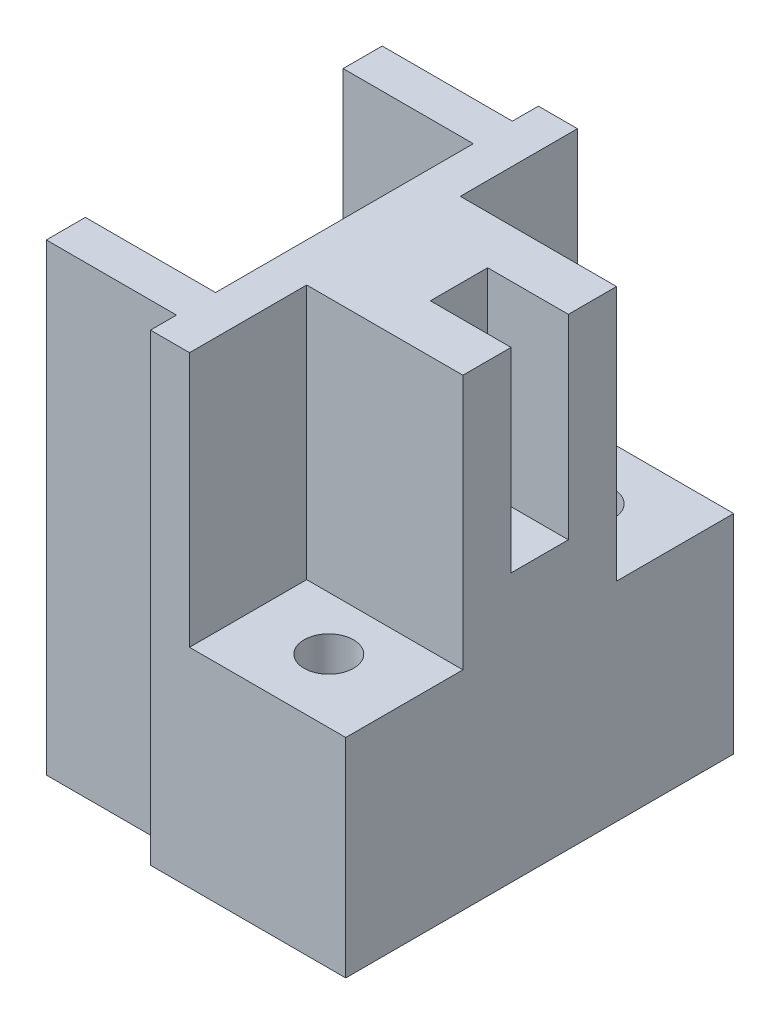
ISO-10303-21;
HEADER;
FILE_DESCRIPTION(('STEP AP214'),'2;1');
FILE_NAME('part.step','',(''),(''),'','','');
FILE_SCHEMA(('AUTOMOTIVE_DESIGN { 1 0 10303 214 1 1 1 1 }'));
ENDSEC;
DATA;
#1=APPLICATION_CONTEXT('core data for automotive mechanical design processes');
#2=APPLICATION_PROTOCOL_DEFINITION('international standard','automotive_design',2000,#1);
#3=PRODUCT_CONTEXT('',#1,'mechanical');
#4=PRODUCT('Part','Part','',(#3));
#5=PRODUCT_RELATED_PRODUCT_CATEGORY('part','',(#4));
#6=PRODUCT_DEFINITION_FORMATION('','',#4);
#7=PRODUCT_DEFINITION_CONTEXT('part definition',#1,'design');
#8=PRODUCT_DEFINITION('design','',#6,#7);
#9=PRODUCT_DEFINITION_SHAPE('','',#8);
#10=(LENGTH_UNIT() NAMED_UNIT(*) SI_UNIT(.MILLI.,.METRE.));
#11=(NAMED_UNIT(*) PLANE_ANGLE_UNIT() SI_UNIT($,.RADIAN.));
#12=(NAMED_UNIT(*) SI_UNIT($,.STERADIAN.) SOLID_ANGLE_UNIT());
#13=UNCERTAINTY_MEASURE_WITH_UNIT(LENGTH_MEASURE(1.E-05),#10,'distance_accuracy_value','');
#14=(GEOMETRIC_REPRESENTATION_CONTEXT(3) GLOBAL_UNCERTAINTY_ASSIGNED_CONTEXT((#13)) GLOBAL_UNIT_ASSIGNED_CONTEXT((#10,
#11,#12)) REPRESENTATION_CONTEXT('',''));
#15=CARTESIAN_POINT('',(0.,0.,0.));
#16=DIRECTION('',(0.,0.,1.));
#17=DIRECTION('',(1.,0.,0.));
#18=AXIS2_PLACEMENT_3D('',#15,#16,#17);
#19=CARTESIAN_POINT('',(32.3777015304282,45.212,-5.59150710167351));
#20=DIRECTION('',(0.,-1.,0.));
#21=DIRECTION('',(0.,0.,-1.));
#22=AXIS2_PLACEMENT_3D('',#19,#20,#21);
#23=CYLINDRICAL_SURFACE('',#22,2.413);
#24=CARTESIAN_POINT('',(32.3777015304282,0.,-5.59150710167351));
#25=DIRECTION('',(0.,1.,0.));
#26=DIRECTION('',(0.,0.,1.));
#27=AXIS2_PLACEMENT_3D('',#24,#25,#26);
#28=CIRCLE('',#27,2.413);
#29=CARTESIAN_POINT('',(32.3777015304282,0.,-8.0045071016735));
#30=VERTEX_POINT('',#29);
#31=EDGE_CURVE('E286',#30,#30,#28,.T.);
#32=CARTESIAN_POINT('',(32.3777015304282,20.32,-5.59150710167351));
#33=DIRECTION('',(0.,1.,0.));
#34=DIRECTION('',(0.,0.,1.));
#35=AXIS2_PLACEMENT_3D('',#32,#33,#34);
#36=CIRCLE('',#35,2.413);
#37=CARTESIAN_POINT('',(32.3777015304282,20.32,-8.0045071016735));
#38=VERTEX_POINT('',#37);
#39=EDGE_CURVE('E219',#38,#38,#36,.F.);
#40=CARTESIAN_POINT('',(32.3777015304282,0.,-8.0045071016735));
#41=CARTESIAN_POINT('',(32.3777015304282,0.211666666666661,-8.0045071016735));
#42=CARTESIAN_POINT('',(32.3777015304282,0.423333333333329,-8.0045071016735));
#43=CARTESIAN_POINT('',(32.3777015304282,0.846666666666662,-8.0045071016735));
#44=CARTESIAN_POINT('',(32.3777015304282,1.05833333333333,-8.0045071016735));
#45=CARTESIAN_POINT('',(32.3777015304282,1.48166666666666,-8.0045071016735));
#46=CARTESIAN_POINT('',(32.3777015304282,1.69333333333333,-8.0045071016735));
#47=CARTESIAN_POINT('',(32.3777015304282,2.11666666666666,-8.0045071016735));
#48=CARTESIAN_POINT('',(32.3777015304282,2.32833333333333,-8.0045071016735));
#49=CARTESIAN_POINT('',(32.3777015304282,2.75166666666666,-8.0045071016735));
#50=CARTESIAN_POINT('',(32.3777015304282,2.96333333333333,-8.0045071016735));
#51=CARTESIAN_POINT('',(32.3777015304282,3.38666666666666,-8.0045071016735));
#52=CARTESIAN_POINT('',(32.3777015304282,3.59833333333333,-8.0045071016735));
#53=CARTESIAN_POINT('',(32.3777015304282,4.02166666666666,-8.0045071016735));
#54=CARTESIAN_POINT('',(32.3777015304282,4.23333333333333,-8.0045071016735));
#55=CARTESIAN_POINT('',(32.3777015304282,4.65666666666666,-8.0045071016735));
#56=CARTESIAN_POINT('',(32.3777015304282,4.86833333333333,-8.0045071016735));
#57=CARTESIAN_POINT('',(32.3777015304282,5.29166666666666,-8.0045071016735));
#58=CARTESIAN_POINT('',(32.3777015304282,5.50333333333333,-8.0045071016735));
#59=CARTESIAN_POINT('',(32.3777015304282,5.92666666666666,-8.0045071016735));
#60=CARTESIAN_POINT('',(32.3777015304282,6.13833333333333,-8.0045071016735));
#61=CARTESIAN_POINT('',(32.3777015304282,6.56166666666666,-8.0045071016735));
#62=CARTESIAN_POINT('',(32.3777015304282,6.77333333333333,-8.0045071016735));
#63=CARTESIAN_POINT('',(32.3777015304282,7.19666666666666,-8.0045071016735));
#64=CARTESIAN_POINT('',(32.3777015304282,7.40833333333333,-8.0045071016735));
#65=CARTESIAN_POINT('',(32.3777015304282,7.83166666666666,-8.0045071016735));
#66=CARTESIAN_POINT('',(32.3777015304282,8.04333333333333,-8.0045071016735));
#67=CARTESIAN_POINT('',(32.3777015304282,8.46666666666667,-8.0045071016735));
#68=CARTESIAN_POINT('',(32.3777015304282,8.67833333333333,-8.0045071016735));
#69=CARTESIAN_POINT('',(32.3777015304282,9.10166666666667,-8.0045071016735));
#70=CARTESIAN_POINT('',(32.3777015304282,9.31333333333333,-8.0045071016735));
#71=CARTESIAN_POINT('',(32.3777015304282,9.73666666666666,-8.0045071016735));
#72=CARTESIAN_POINT('',(32.3777015304282,9.94833333333333,-8.0045071016735));
#73=CARTESIAN_POINT('',(32.3777015304282,10.3716666666667,-8.0045071016735));
#74=CARTESIAN_POINT('',(32.3777015304282,10.5833333333333,-8.0045071016735));
#75=CARTESIAN_POINT('',(32.3777015304282,11.0066666666667,-8.0045071016735));
#76=CARTESIAN_POINT('',(32.3777015304282,11.2183333333333,-8.0045071016735));
#77=CARTESIAN_POINT('',(32.3777015304282,11.6416666666667,-8.0045071016735));
#78=CARTESIAN_POINT('',(32.3777015304282,11.8533333333333,-8.0045071016735));
#79=CARTESIAN_POINT('',(32.3777015304282,12.2766666666667,-8.0045071016735));
#80=CARTESIAN_POINT('',(32.3777015304282,12.4883333333333,-8.0045071016735));
#81=CARTESIAN_POINT('',(32.3777015304282,12.9116666666667,-8.0045071016735));
#82=CARTESIAN_POINT('',(32.3777015304282,13.1233333333333,-8.0045071016735));
#83=CARTESIAN_POINT('',(32.3777015304282,13.5466666666667,-8.0045071016735));
#84=CARTESIAN_POINT('',(32.3777015304282,13.7583333333333,-8.0045071016735));
#85=CARTESIAN_POINT('',(32.3777015304282,14.1816666666667,-8.0045071016735));
#86=CARTESIAN_POINT('',(32.3777015304282,14.3933333333333,-8.0045071016735));
#87=CARTESIAN_POINT('',(32.3777015304282,14.8166666666667,-8.0045071016735));
#88=CARTESIAN_POINT('',(32.3777015304282,15.0283333333333,-8.0045071016735));
#89=CARTESIAN_POINT('',(32.3777015304282,15.4516666666667,-8.0045071016735));
#90=CARTESIAN_POINT('',(32.3777015304282,15.6633333333333,-8.0045071016735));
#91=CARTESIAN_POINT('',(32.3777015304282,16.0866666666667,-8.0045071016735));
#92=CARTESIAN_POINT('',(32.3777015304282,16.2983333333333,-8.0045071016735));
#93=CARTESIAN_POINT('',(32.3777015304282,16.7216666666667,-8.0045071016735));
#94=CARTESIAN_POINT('',(32.3777015304282,16.9333333333333,-8.0045071016735));
#95=CARTESIAN_POINT('',(32.3777015304282,17.3566666666667,-8.0045071016735));
#96=CARTESIAN_POINT('',(32.3777015304282,17.5683333333333,-8.0045071016735));
#97=CARTESIAN_POINT('',(32.3777015304282,17.9916666666667,-8.0045071016735));
#98=CARTESIAN_POINT('',(32.3777015304282,18.2033333333333,-8.0045071016735));
#99=CARTESIAN_POINT('',(32.3777015304282,18.6266666666667,-8.0045071016735));
#100=CARTESIAN_POINT('',(32.3777015304282,18.8383333333333,-8.0045071016735));
#101=CARTESIAN_POINT('',(32.3777015304282,19.2616666666667,-8.0045071016735));
#102=CARTESIAN_POINT('',(32.3777015304282,19.4733333333333,-8.0045071016735));
#103=CARTESIAN_POINT('',(32.3777015304282,19.8966666666667,-8.0045071016735));
#104=CARTESIAN_POINT('',(32.3777015304282,20.1083333333333,-8.0045071016735));
#105=CARTESIAN_POINT('',(32.3777015304282,20.32,-8.0045071016735));
#106=B_SPLINE_CURVE_WITH_KNOTS('',3,(#40,#41,#42,#43,#44,#45,#46,#47,#48,#49,#50,#51,#52,#53,
#54,#55,#56,#57,#58,#59,#60,#61,#62,#63,#64,#65,#66,#67,#68,#69,#70,#71,#72,#73,#74,#75,#76,#77,
#78,#79,#80,#81,#82,#83,#84,#85,#86,#87,#88,#89,#90,#91,#92,#93,#94,#95,#96,#97,#98,#99,#100,
#101,#102,#103,#104,#105),.UNSPECIFIED.,.F.,.F.,(4,2,2,2,2,2,2,2,2,2,2,2,2,2,2,2,2,2,2,2,2,2,2,
2,2,2,2,2,2,2,2,2,4),(0.,0.635000000000004,1.27,1.905,2.54,3.175,3.81,4.445,5.08,
5.71500000000001,6.35,6.985,7.62,8.25500000000001,8.89000000000001,9.52500000000001,10.16,
10.795,11.43,12.065,12.7,13.335,13.97,14.605,15.24,15.875,16.51,17.145,17.78,18.415,19.05,
19.685,20.32),.UNSPECIFIED.);
#107=EDGE_CURVE('BSEAM48',#30,#38,#106,.T.);
#108=ORIENTED_EDGE('',*,*,#31,.F.);
#109=ORIENTED_EDGE('',*,*,#39,.F.);
#110=ORIENTED_EDGE('',*,*,#107,.T.);
#111=ORIENTED_EDGE('',*,*,#107,.F.);
#112=EDGE_LOOP('',(#108,#110,#109,#111));
#113=FACE_BOUND('',#112,.T.);
#114=ADVANCED_FACE('F48',(#113),#23,.F.);
#115=CARTESIAN_POINT('',(32.3777015304282,45.212,-30.9915071016735));
#116=DIRECTION('',(0.,-1.,0.));
#117=DIRECTION('',(0.,0.,-1.));
#118=AXIS2_PLACEMENT_3D('',#115,#116,#117);
#119=CYLINDRICAL_SURFACE('',#118,2.413);
#120=CARTESIAN_POINT('',(32.3777015304282,0.,-30.9915071016735));
#121=DIRECTION('',(0.,1.,0.));
#122=DIRECTION('',(0.,0.,1.));
#123=AXIS2_PLACEMENT_3D('',#120,#121,#122);
#124=CIRCLE('',#123,2.413);
#125=CARTESIAN_POINT('',(32.3777015304282,0.,-33.4045071016735));
#126=VERTEX_POINT('',#125);
#127=EDGE_CURVE('E292',#126,#126,#124,.T.);
#128=CARTESIAN_POINT('',(32.3777015304282,20.32,-30.9915071016735));
#129=DIRECTION('',(0.,1.,0.));
#130=DIRECTION('',(0.,0.,1.));
#131=AXIS2_PLACEMENT_3D('',#128,#129,#130);
#132=CIRCLE('',#131,2.413);
#133=CARTESIAN_POINT('',(32.3777015304282,20.32,-33.4045071016735));
#134=VERTEX_POINT('',#133);
#135=EDGE_CURVE('E241',#134,#134,#132,.F.);
#136=CARTESIAN_POINT('',(32.3777015304282,0.,-33.4045071016735));
#137=CARTESIAN_POINT('',(32.3777015304282,0.211666666666661,-33.4045071016735));
#138=CARTESIAN_POINT('',(32.3777015304282,0.423333333333329,-33.4045071016735));
#139=CARTESIAN_POINT('',(32.3777015304282,0.846666666666662,-33.4045071016735));
#140=CARTESIAN_POINT('',(32.3777015304282,1.05833333333333,-33.4045071016735));
#141=CARTESIAN_POINT('',(32.3777015304282,1.48166666666666,-33.4045071016735));
#142=CARTESIAN_POINT('',(32.3777015304282,1.69333333333333,-33.4045071016735));
#143=CARTESIAN_POINT('',(32.3777015304282,2.11666666666666,-33.4045071016735));
#144=CARTESIAN_POINT('',(32.3777015304282,2.32833333333333,-33.4045071016735));
#145=CARTESIAN_POINT('',(32.3777015304282,2.75166666666666,-33.4045071016735));
#146=CARTESIAN_POINT('',(32.3777015304282,2.96333333333333,-33.4045071016735));
#147=CARTESIAN_POINT('',(32.3777015304282,3.38666666666666,-33.4045071016735));
#148=CARTESIAN_POINT('',(32.3777015304282,3.59833333333333,-33.4045071016735));
#149=CARTESIAN_POINT('',(32.3777015304282,4.02166666666666,-33.4045071016735));
#150=CARTESIAN_POINT('',(32.3777015304282,4.23333333333333,-33.4045071016735));
#151=CARTESIAN_POINT('',(32.3777015304282,4.65666666666666,-33.4045071016735));
#152=CARTESIAN_POINT('',(32.3777015304282,4.86833333333333,-33.4045071016735));
#153=CARTESIAN_POINT('',(32.3777015304282,5.29166666666666,-33.4045071016735));
#154=CARTESIAN_POINT('',(32.3777015304282,5.50333333333333,-33.4045071016735));
#155=CARTESIAN_POINT('',(32.3777015304282,5.92666666666666,-33.4045071016735));
#156=CARTESIAN_POINT('',(32.3777015304282,6.13833333333333,-33.4045071016735));
#157=CARTESIAN_POINT('',(32.3777015304282,6.56166666666666,-33.4045071016735));
#158=CARTESIAN_POINT('',(32.3777015304282,6.77333333333333,-33.4045071016735));
#159=CARTESIAN_POINT('',(32.3777015304282,7.19666666666666,-33.4045071016735));
#160=CARTESIAN_POINT('',(32.3777015304282,7.40833333333333,-33.4045071016735));
#161=CARTESIAN_POINT('',(32.3777015304282,7.83166666666666,-33.4045071016735));
#162=CARTESIAN_POINT('',(32.3777015304282,8.04333333333333,-33.4045071016735));
#163=CARTESIAN_POINT('',(32.3777015304282,8.46666666666667,-33.4045071016735));
#164=CARTESIAN_POINT('',(32.3777015304282,8.67833333333333,-33.4045071016735));
#165=CARTESIAN_POINT('',(32.3777015304282,9.10166666666667,-33.4045071016735));
#166=CARTESIAN_POINT('',(32.3777015304282,9.31333333333333,-33.4045071016735));
#167=CARTESIAN_POINT('',(32.3777015304282,9.73666666666666,-33.4045071016735));
#168=CARTESIAN_POINT('',(32.3777015304282,9.94833333333333,-33.4045071016735));
#169=CARTESIAN_POINT('',(32.3777015304282,10.3716666666667,-33.4045071016735));
#170=CARTESIAN_POINT('',(32.3777015304282,10.5833333333333,-33.4045071016735));
#171=CARTESIAN_POINT('',(32.3777015304282,11.0066666666667,-33.4045071016735));
#172=CARTESIAN_POINT('',(32.3777015304282,11.2183333333333,-33.4045071016735));
#173=CARTESIAN_POINT('',(32.3777015304282,11.6416666666667,-33.4045071016735));
#174=CARTESIAN_POINT('',(32.3777015304282,11.8533333333333,-33.4045071016735));
#175=CARTESIAN_POINT('',(32.3777015304282,12.2766666666667,-33.4045071016735));
#176=CARTESIAN_POINT('',(32.3777015304282,12.4883333333333,-33.4045071016735));
#177=CARTESIAN_POINT('',(32.3777015304282,12.9116666666667,-33.4045071016735));
#178=CARTESIAN_POINT('',(32.3777015304282,13.1233333333333,-33.4045071016735));
#179=CARTESIAN_POINT('',(32.3777015304282,13.5466666666667,-33.4045071016735));
#180=CARTESIAN_POINT('',(32.3777015304282,13.7583333333333,-33.4045071016735));
#181=CARTESIAN_POINT('',(32.3777015304282,14.1816666666667,-33.4045071016735));
#182=CARTESIAN_POINT('',(32.3777015304282,14.3933333333333,-33.4045071016735));
#183=CARTESIAN_POINT('',(32.3777015304282,14.8166666666667,-33.4045071016735));
#184=CARTESIAN_POINT('',(32.3777015304282,15.0283333333333,-33.4045071016735));
#185=CARTESIAN_POINT('',(32.3777015304282,15.4516666666667,-33.4045071016735));
#186=CARTESIAN_POINT('',(32.3777015304282,15.6633333333333,-33.4045071016735));
#187=CARTESIAN_POINT('',(32.3777015304282,16.0866666666667,-33.4045071016735));
#188=CARTESIAN_POINT('',(32.3777015304282,16.2983333333333,-33.4045071016735));
#189=CARTESIAN_POINT('',(32.3777015304282,16.7216666666667,-33.4045071016735));
#190=CARTESIAN_POINT('',(32.3777015304282,16.9333333333333,-33.4045071016735));
#191=CARTESIAN_POINT('',(32.3777015304282,17.3566666666667,-33.4045071016735));
#192=CARTESIAN_POINT('',(32.3777015304282,17.5683333333333,-33.4045071016735));
#193=CARTESIAN_POINT('',(32.3777015304282,17.9916666666667,-33.4045071016735));
#194=CARTESIAN_POINT('',(32.3777015304282,18.2033333333333,-33.4045071016735));
#195=CARTESIAN_POINT('',(32.3777015304282,18.6266666666667,-33.4045071016735));
#196=CARTESIAN_POINT('',(32.3777015304282,18.8383333333333,-33.4045071016735));
#197=CARTESIAN_POINT('',(32.3777015304282,19.2616666666667,-33.4045071016735));
#198=CARTESIAN_POINT('',(32.3777015304282,19.4733333333333,-33.4045071016735));
#199=CARTESIAN_POINT('',(32.3777015304282,19.8966666666667,-33.4045071016735));
#200=CARTESIAN_POINT('',(32.3777015304282,20.1083333333333,-33.4045071016735));
#201=CARTESIAN_POINT('',(32.3777015304282,20.32,-33.4045071016735));
#202=B_SPLINE_CURVE_WITH_KNOTS('',3,(#136,#137,#138,#139,#140,#141,#142,#143,#144,#145,#146,
#147,#148,#149,#150,#151,#152,#153,#154,#155,#156,#157,#158,#159,#160,#161,#162,#163,#164,#165,
#166,#167,#168,#169,#170,#171,#172,#173,#174,#175,#176,#177,#178,#179,#180,#181,#182,#183,#184,
#185,#186,#187,#188,#189,#190,#191,#192,#193,#194,#195,#196,#197,#198,#199,#200,#201),
.UNSPECIFIED.,.F.,.F.,(4,2,2,2,2,2,2,2,2,2,2,2,2,2,2,2,2,2,2,2,2,2,2,2,2,2,2,2,2,2,2,2,4),(0.,
0.635000000000004,1.27,1.905,2.54,3.175,3.81,4.445,5.08,5.71500000000001,6.35,6.985,7.62,
8.25500000000001,8.89000000000001,9.52500000000001,10.16,10.795,11.43,12.065,12.7,13.335,13.97,
14.605,15.24,15.875,16.51,17.145,17.78,18.415,19.05,19.685,20.32),.UNSPECIFIED.);
#203=EDGE_CURVE('BSEAM538',#126,#134,#202,.T.);
#204=ORIENTED_EDGE('',*,*,#127,.F.);
#205=ORIENTED_EDGE('',*,*,#135,.F.);
#206=ORIENTED_EDGE('',*,*,#203,.T.);
#207=ORIENTED_EDGE('',*,*,#203,.F.);
#208=EDGE_LOOP('',(#204,#206,#205,#207));
#209=FACE_BOUND('',#208,.T.);
#210=ADVANCED_FACE('F538',(#209),#119,.F.);
#211=CARTESIAN_POINT('',(0.,45.212,-15.4975071016735));
#212=DIRECTION('',(0.,0.,-1.));
#213=DIRECTION('',(-1.,0.,0.));
#214=AXIS2_PLACEMENT_3D('',#211,#212,#213);
#215=PLANE('',#214);
#216=DIRECTION('',(1.,0.,0.));
#217=VECTOR('',#216,1.);
#218=CARTESIAN_POINT('',(0.,26.162,-15.4975071016735));
#219=LINE('',#218,#217);
#220=CARTESIAN_POINT('',(32.3777015304282,26.162,-15.4975071016735));
#221=VERTEX_POINT('',#220);
#222=CARTESIAN_POINT('',(40.2517015304282,26.162,-15.4975071016735));
#223=VERTEX_POINT('',#222);
#224=EDGE_CURVE('E279',#221,#223,#219,.T.);
#225=ORIENTED_EDGE('',*,*,#224,.F.);
#226=DIRECTION('',(0.,-1.,0.));
#227=VECTOR('',#226,1.);
#228=CARTESIAN_POINT('',(32.3777015304282,45.212,-15.4975071016735));
#229=LINE('',#228,#227);
#230=CARTESIAN_POINT('',(32.3777015304282,45.212,-15.4975071016735));
#231=VERTEX_POINT('',#230);
#232=EDGE_CURVE('E12',#231,#221,#229,.T.);
#233=ORIENTED_EDGE('',*,*,#232,.F.);
#234=DIRECTION('',(1.,0.,0.));
#235=VECTOR('',#234,1.);
#236=CARTESIAN_POINT('',(0.,45.212,-15.4975071016735));
#237=LINE('',#236,#235);
#238=CARTESIAN_POINT('',(40.2517015304282,45.212,-15.4975071016735));
#239=VERTEX_POINT('',#238);
#240=EDGE_CURVE('E287',#231,#239,#237,.T.);
#241=ORIENTED_EDGE('',*,*,#240,.T.);
#242=DIRECTION('',(0.,-1.,0.));
#243=VECTOR('',#242,1.);
#244=CARTESIAN_POINT('',(40.2517015304282,45.212,-15.4975071016735));
#245=LINE('',#244,#243);
#246=EDGE_CURVE('E346',#239,#223,#245,.T.);
#247=ORIENTED_EDGE('',*,*,#246,.T.);
#248=EDGE_LOOP('',(#225,#233,#241,#247));
#249=FACE_BOUND('',#248,.T.);
#250=ADVANCED_FACE('F464',(#249),#215,.T.);
#251=CARTESIAN_POINT('',(32.3777015304282,45.212,0.));
#252=DIRECTION('',(1.,0.,0.));
#253=DIRECTION('',(0.,0.,-1.));
#254=AXIS2_PLACEMENT_3D('',#251,#252,#253);
#255=PLANE('',#254);
#256=DIRECTION('',(0.,0.,1.));
#257=VECTOR('',#256,1.);
#258=CARTESIAN_POINT('',(32.3777015304282,26.162,0.));
#259=LINE('',#258,#257);
#260=CARTESIAN_POINT('',(32.3777015304282,26.162,-21.0855071016735));
#261=VERTEX_POINT('',#260);
#262=EDGE_CURVE('E276',#261,#221,#259,.T.);
#263=ORIENTED_EDGE('',*,*,#262,.F.);
#264=DIRECTION('',(0.,-1.,0.));
#265=VECTOR('',#264,1.);
#266=CARTESIAN_POINT('',(32.3777015304282,45.212,-21.0855071016735));
#267=LINE('',#266,#265);
#268=CARTESIAN_POINT('',(32.3777015304282,45.212,-21.0855071016735));
#269=VERTEX_POINT('',#268);
#270=EDGE_CURVE('E56',#269,#261,#267,.T.);
#271=ORIENTED_EDGE('',*,*,#270,.F.);
#272=DIRECTION('',(0.,0.,1.));
#273=VECTOR('',#272,1.);
#274=CARTESIAN_POINT('',(32.3777015304282,45.212,0.));
#275=LINE('',#274,#273);
#276=EDGE_CURVE('E291',#269,#231,#275,.T.);
#277=ORIENTED_EDGE('',*,*,#276,.T.);
#278=ORIENTED_EDGE('',*,*,#232,.T.);
#279=EDGE_LOOP('',(#263,#271,#277,#278));
#280=FACE_BOUND('',#279,.T.);
#281=ADVANCED_FACE('F456',(#280),#255,.T.);
#282=CARTESIAN_POINT('',(0.,45.212,-21.0855071016735));
#283=DIRECTION('',(0.,0.,1.));
#284=DIRECTION('',(1.,0.,0.));
#285=AXIS2_PLACEMENT_3D('',#282,#283,#284);
#286=PLANE('',#285);
#287=DIRECTION('',(-1.,0.,0.));
#288=VECTOR('',#287,1.);
#289=CARTESIAN_POINT('',(0.,26.162,-21.0855071016735));
#290=LINE('',#289,#288);
#291=CARTESIAN_POINT('',(40.2517015304281,26.162,-21.0855071016735));
#292=VERTEX_POINT('',#291);
#293=EDGE_CURVE('E238',#292,#261,#290,.T.);
#294=ORIENTED_EDGE('',*,*,#293,.F.);
#295=DIRECTION('',(0.,-1.,0.));
#296=VECTOR('',#295,1.);
#297=CARTESIAN_POINT('',(40.2517015304281,45.212,-21.0855071016735));
#298=LINE('',#297,#296);
#299=CARTESIAN_POINT('',(40.2517015304281,45.212,-21.0855071016735));
#300=VERTEX_POINT('',#299);
#301=EDGE_CURVE('E443',#300,#292,#298,.T.);
#302=ORIENTED_EDGE('',*,*,#301,.F.);
#303=DIRECTION('',(-1.,0.,0.));
#304=VECTOR('',#303,1.);
#305=CARTESIAN_POINT('',(0.,45.212,-21.0855071016735));
#306=LINE('',#305,#304);
#307=EDGE_CURVE('E296',#300,#269,#306,.T.);
#308=ORIENTED_EDGE('',*,*,#307,.T.);
#309=ORIENTED_EDGE('',*,*,#270,.T.);
#310=EDGE_LOOP('',(#294,#302,#308,#309));
#311=FACE_BOUND('',#310,.T.);
#312=ADVANCED_FACE('F450',(#311),#286,.T.);
#313=CARTESIAN_POINT('',(0.,45.212,-37.2145071016735));
#314=DIRECTION('',(0.,0.,1.));
#315=DIRECTION('',(1.,0.,0.));
#316=AXIS2_PLACEMENT_3D('',#313,#314,#315);
#317=PLANE('',#316);
#318=DIRECTION('',(-1.,0.,0.));
#319=VECTOR('',#318,1.);
#320=CARTESIAN_POINT('',(0.,45.212,-37.2145071016735));
#321=LINE('',#320,#319);
#322=CARTESIAN_POINT('',(25.0117015304281,45.212,-37.2145071016735));
#323=VERTEX_POINT('',#322);
#324=CARTESIAN_POINT('',(21.2017015304281,45.212,-37.2145071016735));
#325=VERTEX_POINT('',#324);
#326=EDGE_CURVE('E303',#323,#325,#321,.T.);
#327=ORIENTED_EDGE('',*,*,#326,.F.);
#328=DIRECTION('',(0.,1.,0.));
#329=VECTOR('',#328,1.);
#330=CARTESIAN_POINT('',(25.0117015304281,20.32,-37.2145071016735));
#331=LINE('',#330,#329);
#332=CARTESIAN_POINT('',(25.0117015304281,20.32,-37.2145071016735));
#333=VERTEX_POINT('',#332);
#334=EDGE_CURVE('E232',#333,#323,#331,.T.);
#335=ORIENTED_EDGE('',*,*,#334,.F.);
#336=DIRECTION('',(-1.,0.,0.));
#337=VECTOR('',#336,1.);
#338=CARTESIAN_POINT('',(0.,20.32,-37.2145071016735));
#339=LINE('',#338,#337);
#340=CARTESIAN_POINT('',(40.2517015304281,20.32,-37.2145071016735));
#341=VERTEX_POINT('',#340);
#342=EDGE_CURVE('E257',#341,#333,#339,.T.);
#343=ORIENTED_EDGE('',*,*,#342,.F.);
#344=DIRECTION('',(0.,-1.,0.));
#345=VECTOR('',#344,1.);
#346=CARTESIAN_POINT('',(40.2517015304281,45.212,-37.2145071016735));
#347=LINE('',#346,#345);
#348=CARTESIAN_POINT('',(40.2517015304281,0.,-37.2145071016735));
#349=VERTEX_POINT('',#348);
#350=EDGE_CURVE('E440',#341,#349,#347,.T.);
#351=ORIENTED_EDGE('',*,*,#350,.T.);
#352=DIRECTION('',(-1.,0.,0.));
#353=VECTOR('',#352,1.);
#354=CARTESIAN_POINT('',(0.,0.,-37.2145071016735));
#355=LINE('',#354,#353);
#356=CARTESIAN_POINT('',(21.2017015304281,0.,-37.2145071016735));
#357=VERTEX_POINT('',#356);
#358=EDGE_CURVE('E350',#349,#357,#355,.T.);
#359=ORIENTED_EDGE('',*,*,#358,.T.);
#360=DIRECTION('',(0.,-1.,0.));
#361=VECTOR('',#360,1.);
#362=CARTESIAN_POINT('',(21.2017015304281,45.212,-37.2145071016735));
#363=LINE('',#362,#361);
#364=EDGE_CURVE('E436',#325,#357,#363,.T.);
#365=ORIENTED_EDGE('',*,*,#364,.F.);
#366=EDGE_LOOP('',(#327,#335,#343,#351,#359,#365));
#367=FACE_BOUND('',#366,.T.);
#368=ADVANCED_FACE('F482',(#367),#317,.F.);
#369=CARTESIAN_POINT('',(21.2017015304281,45.212,0.));
#370=DIRECTION('',(1.,0.,0.));
#371=DIRECTION('',(0.,0.,-1.));
#372=AXIS2_PLACEMENT_3D('',#369,#370,#371);
#373=PLANE('',#372);
#374=DIRECTION('',(0.,0.,1.));
#375=VECTOR('',#374,1.);
#376=CARTESIAN_POINT('',(21.2017015304281,0.,0.));
#377=LINE('',#376,#375);
#378=CARTESIAN_POINT('',(21.2017015304281,0.,-34.6745071016735));
#379=VERTEX_POINT('',#378);
#380=EDGE_CURVE('E354',#357,#379,#377,.T.);
#381=ORIENTED_EDGE('',*,*,#380,.T.);
#382=DIRECTION('',(0.,-1.,0.));
#383=VECTOR('',#382,1.);
#384=CARTESIAN_POINT('',(21.2017015304281,45.212,-34.6745071016735));
#385=LINE('',#384,#383);
#386=CARTESIAN_POINT('',(21.2017015304281,45.212,-34.6745071016735));
#387=VERTEX_POINT('',#386);
#388=EDGE_CURVE('E432',#387,#379,#385,.T.);
#389=ORIENTED_EDGE('',*,*,#388,.F.);
#390=DIRECTION('',(0.,0.,1.));
#391=VECTOR('',#390,1.);
#392=CARTESIAN_POINT('',(21.2017015304281,45.212,0.));
#393=LINE('',#392,#391);
#394=EDGE_CURVE('E306',#325,#387,#393,.T.);
#395=ORIENTED_EDGE('',*,*,#394,.F.);
#396=ORIENTED_EDGE('',*,*,#364,.T.);
#397=EDGE_LOOP('',(#381,#389,#395,#396));
#398=FACE_BOUND('',#397,.T.);
#399=ADVANCED_FACE('F487',(#398),#373,.F.);
#400=CARTESIAN_POINT('',(0.,45.212,-34.6745071016735));
#401=DIRECTION('',(0.,0.,1.));
#402=DIRECTION('',(1.,0.,0.));
#403=AXIS2_PLACEMENT_3D('',#400,#401,#402);
#404=PLANE('',#403);
#405=DIRECTION('',(-1.,0.,0.));
#406=VECTOR('',#405,1.);
#407=CARTESIAN_POINT('',(0.,0.,-34.6745071016735));
#408=LINE('',#407,#406);
#409=CARTESIAN_POINT('',(8.50170153042815,0.,-34.6745071016735));
#410=VERTEX_POINT('',#409);
#411=EDGE_CURVE('E358',#379,#410,#408,.T.);
#412=ORIENTED_EDGE('',*,*,#411,.T.);
#413=DIRECTION('',(0.,-1.,0.));
#414=VECTOR('',#413,1.);
#415=CARTESIAN_POINT('',(8.50170153042815,45.212,-34.6745071016735));
#416=LINE('',#415,#414);
#417=CARTESIAN_POINT('',(8.50170153042815,45.212,-34.6745071016735));
#418=VERTEX_POINT('',#417);
#419=EDGE_CURVE('E428',#418,#410,#416,.T.);
#420=ORIENTED_EDGE('',*,*,#419,.F.);
#421=DIRECTION('',(-1.,0.,0.));
#422=VECTOR('',#421,1.);
#423=CARTESIAN_POINT('',(0.,45.212,-34.6745071016735));
#424=LINE('',#423,#422);
#425=EDGE_CURVE('E310',#387,#418,#424,.T.);
#426=ORIENTED_EDGE('',*,*,#425,.F.);
#427=ORIENTED_EDGE('',*,*,#388,.T.);
#428=EDGE_LOOP('',(#412,#420,#426,#427));
#429=FACE_BOUND('',#428,.T.);
#430=ADVANCED_FACE('F489',(#429),#404,.F.);
#431=CARTESIAN_POINT('',(8.50170153042816,45.212,0.));
#432=DIRECTION('',(1.,0.,0.));
#433=DIRECTION('',(0.,0.,-1.));
#434=AXIS2_PLACEMENT_3D('',#431,#432,#433);
#435=PLANE('',#434);
#436=DIRECTION('',(0.,0.,1.));
#437=VECTOR('',#436,1.);
#438=CARTESIAN_POINT('',(8.50170153042816,0.,0.));
#439=LINE('',#438,#437);
#440=CARTESIAN_POINT('',(8.50170153042815,0.,-30.8645071016735));
#441=VERTEX_POINT('',#440);
#442=EDGE_CURVE('E362',#410,#441,#439,.T.);
#443=ORIENTED_EDGE('',*,*,#442,.T.);
#444=DIRECTION('',(0.,-1.,0.));
#445=VECTOR('',#444,1.);
#446=CARTESIAN_POINT('',(8.50170153042815,45.212,-30.8645071016735));
#447=LINE('',#446,#445);
#448=CARTESIAN_POINT('',(8.50170153042815,45.212,-30.8645071016735));
#449=VERTEX_POINT('',#448);
#450=EDGE_CURVE('E424',#449,#441,#447,.T.);
#451=ORIENTED_EDGE('',*,*,#450,.F.);
#452=DIRECTION('',(0.,0.,1.));
#453=VECTOR('',#452,1.);
#454=CARTESIAN_POINT('',(8.50170153042816,45.212,0.));
#455=LINE('',#454,#453);
#456=EDGE_CURVE('E314',#418,#449,#455,.T.);
#457=ORIENTED_EDGE('',*,*,#456,.F.);
#458=ORIENTED_EDGE('',*,*,#419,.T.);
#459=EDGE_LOOP('',(#443,#451,#457,#458));
#460=FACE_BOUND('',#459,.T.);
#461=ADVANCED_FACE('F494',(#460),#435,.F.);
#462=CARTESIAN_POINT('',(0.,45.212,-30.8645071016735));
#463=DIRECTION('',(0.,0.,-1.));
#464=DIRECTION('',(-1.,0.,0.));
#465=AXIS2_PLACEMENT_3D('',#462,#463,#464);
#466=PLANE('',#465);
#467=DIRECTION('',(1.,0.,0.));
#468=VECTOR('',#467,1.);
#469=CARTESIAN_POINT('',(0.,0.,-30.8645071016735));
#470=LINE('',#469,#468);
#471=CARTESIAN_POINT('',(21.2017015304281,0.,-30.8645071016735));
#472=VERTEX_POINT('',#471);
#473=EDGE_CURVE('E366',#441,#472,#470,.T.);
#474=ORIENTED_EDGE('',*,*,#473,.T.);
#475=DIRECTION('',(0.,-1.,0.));
#476=VECTOR('',#475,1.);
#477=CARTESIAN_POINT('',(21.2017015304281,45.212,-30.8645071016735));
#478=LINE('',#477,#476);
#479=CARTESIAN_POINT('',(21.2017015304281,45.212,-30.8645071016735));
#480=VERTEX_POINT('',#479);
#481=EDGE_CURVE('E420',#480,#472,#478,.T.);
#482=ORIENTED_EDGE('',*,*,#481,.F.);
#483=DIRECTION('',(1.,0.,0.));
#484=VECTOR('',#483,1.);
#485=CARTESIAN_POINT('',(0.,45.212,-30.8645071016735));
#486=LINE('',#485,#484);
#487=EDGE_CURVE('E318',#449,#480,#486,.T.);
#488=ORIENTED_EDGE('',*,*,#487,.F.);
#489=ORIENTED_EDGE('',*,*,#450,.T.);
#490=EDGE_LOOP('',(#474,#482,#488,#489));
#491=FACE_BOUND('',#490,.T.);
#492=ADVANCED_FACE('F496',(#491),#466,.F.);
#493=CARTESIAN_POINT('',(21.2017015304281,45.212,0.));
#494=DIRECTION('',(1.,0.,0.));
#495=DIRECTION('',(0.,0.,-1.));
#496=AXIS2_PLACEMENT_3D('',#493,#494,#495);
#497=PLANE('',#496);
#498=DIRECTION('',(0.,0.,1.));
#499=VECTOR('',#498,1.);
#500=CARTESIAN_POINT('',(21.2017015304281,0.,0.));
#501=LINE('',#500,#499);
#502=CARTESIAN_POINT('',(21.2017015304281,0.,-5.71850710167351));
#503=VERTEX_POINT('',#502);
#504=EDGE_CURVE('E370',#472,#503,#501,.T.);
#505=ORIENTED_EDGE('',*,*,#504,.T.);
#506=DIRECTION('',(0.,-1.,0.));
#507=VECTOR('',#506,1.);
#508=CARTESIAN_POINT('',(21.2017015304281,45.212,-5.71850710167351));
#509=LINE('',#508,#507);
#510=CARTESIAN_POINT('',(21.2017015304281,45.212,-5.71850710167351));
#511=VERTEX_POINT('',#510);
#512=EDGE_CURVE('E417',#511,#503,#509,.T.);
#513=ORIENTED_EDGE('',*,*,#512,.F.);
#514=DIRECTION('',(0.,0.,1.));
#515=VECTOR('',#514,1.);
#516=CARTESIAN_POINT('',(21.2017015304281,45.212,0.));
#517=LINE('',#516,#515);
#518=EDGE_CURVE('E322',#480,#511,#517,.T.);
#519=ORIENTED_EDGE('',*,*,#518,.F.);
#520=ORIENTED_EDGE('',*,*,#481,.T.);
#521=EDGE_LOOP('',(#505,#513,#519,#520));
#522=FACE_BOUND('',#521,.T.);
#523=ADVANCED_FACE('F498',(#522),#497,.F.);
#524=CARTESIAN_POINT('',(0.,45.212,-5.71850710167351));
#525=DIRECTION('',(0.,0.,-1.));
#526=DIRECTION('',(-1.,0.,0.));
#527=AXIS2_PLACEMENT_3D('',#524,#525,#526);
#528=PLANE('',#527);
#529=DIRECTION('',(1.,0.,0.));
#530=VECTOR('',#529,1.);
#531=CARTESIAN_POINT('',(0.,0.,-5.71850710167351));
#532=LINE('',#531,#530);
#533=CARTESIAN_POINT('',(8.50170153042814,0.,-5.71850710167351));
#534=VERTEX_POINT('',#533);
#535=EDGE_CURVE('E374',#534,#503,#532,.T.);
#536=ORIENTED_EDGE('',*,*,#535,.F.);
#537=DIRECTION('',(0.,-1.,0.));
#538=VECTOR('',#537,1.);
#539=CARTESIAN_POINT('',(8.50170153042814,45.212,-5.71850710167351));
#540=LINE('',#539,#538);
#541=CARTESIAN_POINT('',(8.50170153042814,45.212,-5.71850710167351));
#542=VERTEX_POINT('',#541);
#543=EDGE_CURVE('E414',#542,#534,#540,.T.);
#544=ORIENTED_EDGE('',*,*,#543,.F.);
#545=DIRECTION('',(1.,0.,0.));
#546=VECTOR('',#545,1.);
#547=CARTESIAN_POINT('',(0.,45.212,-5.71850710167351));
#548=LINE('',#547,#546);
#549=EDGE_CURVE('E325',#542,#511,#548,.T.);
#550=ORIENTED_EDGE('',*,*,#549,.T.);
#551=ORIENTED_EDGE('',*,*,#512,.T.);
#552=EDGE_LOOP('',(#536,#544,#550,#551));
#553=FACE_BOUND('',#552,.T.);
#554=ADVANCED_FACE('F527',(#553),#528,.T.);
#555=CARTESIAN_POINT('',(8.50170153042814,45.212,0.));
#556=DIRECTION('',(-1.,0.,0.));
#557=DIRECTION('',(0.,0.,1.));
#558=AXIS2_PLACEMENT_3D('',#555,#556,#557);
#559=PLANE('',#558);
#560=DIRECTION('',(0.,0.,-1.));
#561=VECTOR('',#560,1.);
#562=CARTESIAN_POINT('',(8.50170153042814,0.,0.));
#563=LINE('',#562,#561);
#564=CARTESIAN_POINT('',(8.50170153042814,0.,-1.90850710167351));
#565=VERTEX_POINT('',#564);
#566=EDGE_CURVE('E379',#565,#534,#563,.T.);
#567=ORIENTED_EDGE('',*,*,#566,.F.);
#568=DIRECTION('',(0.,-1.,0.));
#569=VECTOR('',#568,1.);
#570=CARTESIAN_POINT('',(8.50170153042814,45.212,-1.90850710167351));
#571=LINE('',#570,#569);
#572=CARTESIAN_POINT('',(8.50170153042814,45.212,-1.90850710167351));
#573=VERTEX_POINT('',#572);
#574=EDGE_CURVE('E411',#573,#565,#571,.T.);
#575=ORIENTED_EDGE('',*,*,#574,.F.);
#576=DIRECTION('',(0.,0.,-1.));
#577=VECTOR('',#576,1.);
#578=CARTESIAN_POINT('',(8.50170153042814,45.212,0.));
#579=LINE('',#578,#577);
#580=EDGE_CURVE('E330',#573,#542,#579,.T.);
#581=ORIENTED_EDGE('',*,*,#580,.T.);
#582=ORIENTED_EDGE('',*,*,#543,.T.);
#583=EDGE_LOOP('',(#567,#575,#581,#582));
#584=FACE_BOUND('',#583,.T.);
#585=ADVANCED_FACE('F506',(#584),#559,.T.);
#586=CARTESIAN_POINT('',(0.,45.212,-1.90850710167351));
#587=DIRECTION('',(0.,0.,1.));
#588=DIRECTION('',(1.,0.,0.));
#589=AXIS2_PLACEMENT_3D('',#586,#587,#588);
#590=PLANE('',#589);
#591=DIRECTION('',(-1.,0.,0.));
#592=VECTOR('',#591,1.);
#593=CARTESIAN_POINT('',(0.,0.,-1.90850710167351));
#594=LINE('',#593,#592);
#595=CARTESIAN_POINT('',(21.2017015304281,0.,-1.90850710167351));
#596=VERTEX_POINT('',#595);
#597=EDGE_CURVE('E383',#596,#565,#594,.T.);
#598=ORIENTED_EDGE('',*,*,#597,.F.);
#599=DIRECTION('',(0.,-1.,0.));
#600=VECTOR('',#599,1.);
#601=CARTESIAN_POINT('',(21.2017015304281,45.212,-1.90850710167351));
#602=LINE('',#601,#600);
#603=CARTESIAN_POINT('',(21.2017015304281,45.212,-1.90850710167351));
#604=VERTEX_POINT('',#603);
#605=EDGE_CURVE('E408',#604,#596,#602,.T.);
#606=ORIENTED_EDGE('',*,*,#605,.F.);
#607=DIRECTION('',(-1.,0.,0.));
#608=VECTOR('',#607,1.);
#609=CARTESIAN_POINT('',(0.,45.212,-1.90850710167351));
#610=LINE('',#609,#608);
#611=EDGE_CURVE('E334',#604,#573,#610,.T.);
#612=ORIENTED_EDGE('',*,*,#611,.T.);
#613=ORIENTED_EDGE('',*,*,#574,.T.);
#614=EDGE_LOOP('',(#598,#606,#612,#613));
#615=FACE_BOUND('',#614,.T.);
#616=ADVANCED_FACE('F510',(#615),#590,.T.);
#617=CARTESIAN_POINT('',(21.2017015304281,0.,0.63149289832649));
#618=VERTEX_POINT('',#617);
#619=EDGE_CURVE('E375',#596,#618,#501,.T.);
#620=ORIENTED_EDGE('',*,*,#619,.T.);
#621=DIRECTION('',(0.,-1.,0.));
#622=VECTOR('',#621,1.);
#623=CARTESIAN_POINT('',(21.2017015304281,45.212,0.63149289832649));
#624=LINE('',#623,#622);
#625=CARTESIAN_POINT('',(21.2017015304281,45.212,0.63149289832649));
#626=VERTEX_POINT('',#625);
#627=EDGE_CURVE('E404',#626,#618,#624,.T.);
#628=ORIENTED_EDGE('',*,*,#627,.F.);
#629=EDGE_CURVE('E326',#604,#626,#517,.T.);
#630=ORIENTED_EDGE('',*,*,#629,.F.);
#631=ORIENTED_EDGE('',*,*,#605,.T.);
#632=EDGE_LOOP('',(#620,#628,#630,#631));
#633=FACE_BOUND('',#632,.T.);
#634=ADVANCED_FACE('F517',(#633),#497,.F.);
#635=CARTESIAN_POINT('',(0.,45.212,0.63149289832649));
#636=DIRECTION('',(0.,0.,-1.));
#637=DIRECTION('',(-1.,0.,0.));
#638=AXIS2_PLACEMENT_3D('',#635,#636,#637);
#639=PLANE('',#638);
#640=DIRECTION('',(1.,0.,0.));
#641=VECTOR('',#640,1.);
#642=CARTESIAN_POINT('',(0.,20.32,0.63149289832649));
#643=LINE('',#642,#641);
#644=CARTESIAN_POINT('',(25.0117015304282,20.32,0.63149289832649));
#645=VERTEX_POINT('',#644);
#646=CARTESIAN_POINT('',(40.2517015304282,20.32,0.63149289832649));
#647=VERTEX_POINT('',#646);
#648=EDGE_CURVE('E213',#645,#647,#643,.T.);
#649=ORIENTED_EDGE('',*,*,#648,.F.);
#650=DIRECTION('',(0.,1.,0.));
#651=VECTOR('',#650,1.);
#652=CARTESIAN_POINT('',(25.0117015304282,20.32,0.63149289832649));
#653=LINE('',#652,#651);
#654=CARTESIAN_POINT('',(25.0117015304282,45.212,0.63149289832649));
#655=VERTEX_POINT('',#654);
#656=EDGE_CURVE('E203',#645,#655,#653,.T.);
#657=ORIENTED_EDGE('',*,*,#656,.T.);
#658=DIRECTION('',(1.,0.,0.));
#659=VECTOR('',#658,1.);
#660=CARTESIAN_POINT('',(0.,45.212,0.63149289832649));
#661=LINE('',#660,#659);
#662=EDGE_CURVE('E338',#626,#655,#661,.T.);
#663=ORIENTED_EDGE('',*,*,#662,.F.);
#664=ORIENTED_EDGE('',*,*,#627,.T.);
#665=DIRECTION('',(1.,0.,0.));
#666=VECTOR('',#665,1.);
#667=CARTESIAN_POINT('',(0.,0.,0.63149289832649));
#668=LINE('',#667,#666);
#669=CARTESIAN_POINT('',(40.2517015304282,0.,0.63149289832649));
#670=VERTEX_POINT('',#669);
#671=EDGE_CURVE('E387',#618,#670,#668,.T.);
#672=ORIENTED_EDGE('',*,*,#671,.T.);
#673=DIRECTION('',(0.,-1.,0.));
#674=VECTOR('',#673,1.);
#675=CARTESIAN_POINT('',(40.2517015304282,45.212,0.63149289832649));
#676=LINE('',#675,#674);
#677=EDGE_CURVE('E401',#647,#670,#676,.T.);
#678=ORIENTED_EDGE('',*,*,#677,.F.);
#679=EDGE_LOOP('',(#649,#657,#663,#664,#672,#678));
#680=FACE_BOUND('',#679,.T.);
#681=ADVANCED_FACE('F520',(#680),#639,.F.);
#682=CARTESIAN_POINT('',(40.2517015304282,45.212,0.));
#683=DIRECTION('',(1.,0.,0.));
#684=DIRECTION('',(0.,0.,-1.));
#685=AXIS2_PLACEMENT_3D('',#682,#683,#684);
#686=PLANE('',#685);
#687=DIRECTION('',(0.,1.,0.));
#688=VECTOR('',#687,1.);
#689=CARTESIAN_POINT('',(40.2517015304282,20.32,-10.7985071016735));
#690=LINE('',#689,#688);
#691=CARTESIAN_POINT('',(40.2517015304282,20.32,-10.7985071016735));
#692=VERTEX_POINT('',#691);
#693=CARTESIAN_POINT('',(40.2517015304282,45.212,-10.7985071016735));
#694=VERTEX_POINT('',#693);
#695=EDGE_CURVE('E235',#692,#694,#690,.T.);
#696=ORIENTED_EDGE('',*,*,#695,.F.);
#697=DIRECTION('',(0.,0.,-1.));
#698=VECTOR('',#697,1.);
#699=CARTESIAN_POINT('',(40.2517015304282,20.32,0.));
#700=LINE('',#699,#698);
#701=EDGE_CURVE('E204',#647,#692,#700,.T.);
#702=ORIENTED_EDGE('',*,*,#701,.F.);
#703=ORIENTED_EDGE('',*,*,#677,.T.);
#704=DIRECTION('',(0.,0.,1.));
#705=VECTOR('',#704,1.);
#706=CARTESIAN_POINT('',(40.2517015304282,0.,0.));
#707=LINE('',#706,#705);
#708=EDGE_CURVE('E391',#349,#670,#707,.T.);
#709=ORIENTED_EDGE('',*,*,#708,.F.);
#710=ORIENTED_EDGE('',*,*,#350,.F.);
#711=DIRECTION('',(0.,0.,-1.));
#712=VECTOR('',#711,1.);
#713=CARTESIAN_POINT('',(40.2517015304282,20.32,0.));
#714=LINE('',#713,#712);
#715=CARTESIAN_POINT('',(40.2517015304281,20.32,-25.7845071016735));
#716=VERTEX_POINT('',#715);
#717=EDGE_CURVE('E254',#716,#341,#714,.T.);
#718=ORIENTED_EDGE('',*,*,#717,.F.);
#719=DIRECTION('',(0.,1.,0.));
#720=VECTOR('',#719,1.);
#721=CARTESIAN_POINT('',(40.2517015304281,20.32,-25.7845071016735));
#722=LINE('',#721,#720);
#723=CARTESIAN_POINT('',(40.2517015304281,45.212,-25.7845071016735));
#724=VERTEX_POINT('',#723);
#725=EDGE_CURVE('E268',#716,#724,#722,.T.);
#726=ORIENTED_EDGE('',*,*,#725,.T.);
#727=DIRECTION('',(0.,0.,1.));
#728=VECTOR('',#727,1.);
#729=CARTESIAN_POINT('',(40.2517015304282,45.212,0.));
#730=LINE('',#729,#728);
#731=EDGE_CURVE('E300',#724,#300,#730,.T.);
#732=ORIENTED_EDGE('',*,*,#731,.T.);
#733=ORIENTED_EDGE('',*,*,#301,.T.);
#734=DIRECTION('',(0.,0.,1.));
#735=VECTOR('',#734,1.);
#736=CARTESIAN_POINT('',(40.2517015304282,26.162,0.));
#737=LINE('',#736,#735);
#738=EDGE_CURVE('E282',#292,#223,#737,.T.);
#739=ORIENTED_EDGE('',*,*,#738,.T.);
#740=ORIENTED_EDGE('',*,*,#246,.F.);
#741=DIRECTION('',(0.,0.,1.));
#742=VECTOR('',#741,1.);
#743=CARTESIAN_POINT('',(40.2517015304282,45.212,0.));
#744=LINE('',#743,#742);
#745=EDGE_CURVE('E342',#239,#694,#744,.T.);
#746=ORIENTED_EDGE('',*,*,#745,.T.);
#747=EDGE_LOOP('',(#696,#702,#703,#709,#710,#718,#726,#732,#733,#739,#740,#746));
#748=FACE_BOUND('',#747,.T.);
#749=ADVANCED_FACE('F468',(#748),#686,.T.);
#750=CARTESIAN_POINT('',(0.,45.212,0.));
#751=DIRECTION('',(0.,1.,0.));
#752=DIRECTION('',(0.,0.,1.));
#753=AXIS2_PLACEMENT_3D('',#750,#751,#752);
#754=PLANE('',#753);
#755=DIRECTION('',(-1.,0.,0.));
#756=VECTOR('',#755,1.);
#757=CARTESIAN_POINT('',(0.,45.212,-10.7985071016735));
#758=LINE('',#757,#756);
#759=CARTESIAN_POINT('',(25.0117015304282,45.212,-10.7985071016735));
#760=VERTEX_POINT('',#759);
#761=EDGE_CURVE('E63',#694,#760,#758,.T.);
#762=ORIENTED_EDGE('',*,*,#761,.F.);
#763=ORIENTED_EDGE('',*,*,#745,.F.);
#764=ORIENTED_EDGE('',*,*,#240,.F.);
#765=ORIENTED_EDGE('',*,*,#276,.F.);
#766=ORIENTED_EDGE('',*,*,#307,.F.);
#767=ORIENTED_EDGE('',*,*,#731,.F.);
#768=DIRECTION('',(1.,0.,0.));
#769=VECTOR('',#768,1.);
#770=CARTESIAN_POINT('',(0.,45.212,-25.7845071016735));
#771=LINE('',#770,#769);
#772=CARTESIAN_POINT('',(25.0117015304281,45.212,-25.7845071016735));
#773=VERTEX_POINT('',#772);
#774=EDGE_CURVE('E246',#773,#724,#771,.T.);
#775=ORIENTED_EDGE('',*,*,#774,.F.);
#776=DIRECTION('',(0.,0.,1.));
#777=VECTOR('',#776,1.);
#778=CARTESIAN_POINT('',(25.0117015304281,45.212,0.));
#779=LINE('',#778,#777);
#780=EDGE_CURVE('E71',#323,#773,#779,.T.);
#781=ORIENTED_EDGE('',*,*,#780,.F.);
#782=ORIENTED_EDGE('',*,*,#326,.T.);
#783=ORIENTED_EDGE('',*,*,#394,.T.);
#784=ORIENTED_EDGE('',*,*,#425,.T.);
#785=ORIENTED_EDGE('',*,*,#456,.T.);
#786=ORIENTED_EDGE('',*,*,#487,.T.);
#787=ORIENTED_EDGE('',*,*,#518,.T.);
#788=ORIENTED_EDGE('',*,*,#549,.F.);
#789=ORIENTED_EDGE('',*,*,#580,.F.);
#790=ORIENTED_EDGE('',*,*,#611,.F.);
#791=ORIENTED_EDGE('',*,*,#629,.T.);
#792=ORIENTED_EDGE('',*,*,#662,.T.);
#793=DIRECTION('',(0.,0.,1.));
#794=VECTOR('',#793,1.);
#795=CARTESIAN_POINT('',(25.0117015304282,45.212,0.));
#796=LINE('',#795,#794);
#797=EDGE_CURVE('E223',#760,#655,#796,.T.);
#798=ORIENTED_EDGE('',*,*,#797,.F.);
#799=EDGE_LOOP('',(#762,#763,#764,#765,#766,#767,#775,#781,#782,#783,#784,#785,#786,#787,#788,
#789,#790,#791,#792,#798));
#800=FACE_BOUND('',#799,.T.);
#801=ADVANCED_FACE('F459',(#800),#754,.T.);
#802=CARTESIAN_POINT('',(0.,0.,0.));
#803=DIRECTION('',(0.,1.,0.));
#804=DIRECTION('',(0.,0.,1.));
#805=AXIS2_PLACEMENT_3D('',#802,#803,#804);
#806=PLANE('',#805);
#807=ORIENTED_EDGE('',*,*,#31,.T.);
#808=EDGE_LOOP('',(#807));
#809=FACE_BOUND('',#808,.T.);
#810=ORIENTED_EDGE('',*,*,#358,.F.);
#811=ORIENTED_EDGE('',*,*,#708,.T.);
#812=ORIENTED_EDGE('',*,*,#671,.F.);
#813=ORIENTED_EDGE('',*,*,#619,.F.);
#814=ORIENTED_EDGE('',*,*,#597,.T.);
#815=ORIENTED_EDGE('',*,*,#566,.T.);
#816=ORIENTED_EDGE('',*,*,#535,.T.);
#817=ORIENTED_EDGE('',*,*,#504,.F.);
#818=ORIENTED_EDGE('',*,*,#473,.F.);
#819=ORIENTED_EDGE('',*,*,#442,.F.);
#820=ORIENTED_EDGE('',*,*,#411,.F.);
#821=ORIENTED_EDGE('',*,*,#380,.F.);
#822=EDGE_LOOP('',(#810,#811,#812,#813,#814,#815,#816,#817,#818,#819,#820,#821));
#823=FACE_BOUND('',#822,.T.);
#824=ORIENTED_EDGE('',*,*,#127,.T.);
#825=EDGE_LOOP('',(#824));
#826=FACE_BOUND('',#825,.T.);
#827=ADVANCED_FACE('F525',(#809,#823,#826),#806,.F.);
#828=CARTESIAN_POINT('',(0.,26.162,0.));
#829=DIRECTION('',(0.,1.,0.));
#830=DIRECTION('',(0.,0.,1.));
#831=AXIS2_PLACEMENT_3D('',#828,#829,#830);
#832=PLANE('',#831);
#833=ORIENTED_EDGE('',*,*,#293,.T.);
#834=ORIENTED_EDGE('',*,*,#262,.T.);
#835=ORIENTED_EDGE('',*,*,#224,.T.);
#836=ORIENTED_EDGE('',*,*,#738,.F.);
#837=EDGE_LOOP('',(#833,#834,#835,#836));
#838=FACE_BOUND('',#837,.T.);
#839=ADVANCED_FACE('F466',(#838),#832,.T.);
#840=CARTESIAN_POINT('',(25.0117015304281,20.32,0.));
#841=DIRECTION('',(-1.,0.,0.));
#842=DIRECTION('',(0.,0.,1.));
#843=AXIS2_PLACEMENT_3D('',#840,#841,#842);
#844=PLANE('',#843);
#845=ORIENTED_EDGE('',*,*,#780,.T.);
#846=DIRECTION('',(0.,1.,0.));
#847=VECTOR('',#846,1.);
#848=CARTESIAN_POINT('',(25.0117015304281,20.32,-25.7845071016735));
#849=LINE('',#848,#847);
#850=CARTESIAN_POINT('',(25.0117015304281,20.32,-25.7845071016735));
#851=VERTEX_POINT('',#850);
#852=EDGE_CURVE('E261',#851,#773,#849,.T.);
#853=ORIENTED_EDGE('',*,*,#852,.F.);
#854=DIRECTION('',(0.,0.,1.));
#855=VECTOR('',#854,1.);
#856=CARTESIAN_POINT('',(25.0117015304281,20.32,0.));
#857=LINE('',#856,#855);
#858=EDGE_CURVE('E245',#333,#851,#857,.T.);
#859=ORIENTED_EDGE('',*,*,#858,.F.);
#860=ORIENTED_EDGE('',*,*,#334,.T.);
#861=EDGE_LOOP('',(#845,#853,#859,#860));
#862=FACE_BOUND('',#861,.T.);
#863=ADVANCED_FACE('F475',(#862),#844,.F.);
#864=CARTESIAN_POINT('',(0.,20.32,-25.7845071016735));
#865=DIRECTION('',(0.,0.,1.));
#866=DIRECTION('',(1.,0.,0.));
#867=AXIS2_PLACEMENT_3D('',#864,#865,#866);
#868=PLANE('',#867);
#869=ORIENTED_EDGE('',*,*,#774,.T.);
#870=ORIENTED_EDGE('',*,*,#725,.F.);
#871=DIRECTION('',(1.,0.,0.));
#872=VECTOR('',#871,1.);
#873=CARTESIAN_POINT('',(0.,20.32,-25.7845071016735));
#874=LINE('',#873,#872);
#875=EDGE_CURVE('E250',#851,#716,#874,.T.);
#876=ORIENTED_EDGE('',*,*,#875,.F.);
#877=ORIENTED_EDGE('',*,*,#852,.T.);
#878=EDGE_LOOP('',(#869,#870,#876,#877));
#879=FACE_BOUND('',#878,.T.);
#880=ADVANCED_FACE('F473',(#879),#868,.F.);
#881=CARTESIAN_POINT('',(0.,20.32,0.));
#882=DIRECTION('',(0.,1.,0.));
#883=DIRECTION('',(0.,0.,1.));
#884=AXIS2_PLACEMENT_3D('',#881,#882,#883);
#885=PLANE('',#884);
#886=ORIENTED_EDGE('',*,*,#135,.T.);
#887=EDGE_LOOP('',(#886));
#888=FACE_BOUND('',#887,.T.);
#889=ORIENTED_EDGE('',*,*,#858,.T.);
#890=ORIENTED_EDGE('',*,*,#875,.T.);
#891=ORIENTED_EDGE('',*,*,#717,.T.);
#892=ORIENTED_EDGE('',*,*,#342,.T.);
#893=EDGE_LOOP('',(#889,#890,#891,#892));
#894=FACE_BOUND('',#893,.T.);
#895=ADVANCED_FACE('F479',(#888,#894),#885,.T.);
#896=CARTESIAN_POINT('',(0.,20.32,-10.7985071016735));
#897=DIRECTION('',(0.,0.,-1.));
#898=DIRECTION('',(-1.,0.,0.));
#899=AXIS2_PLACEMENT_3D('',#896,#897,#898);
#900=PLANE('',#899);
#901=ORIENTED_EDGE('',*,*,#761,.T.);
#902=DIRECTION('',(0.,1.,0.));
#903=VECTOR('',#902,1.);
#904=CARTESIAN_POINT('',(25.0117015304282,20.32,-10.7985071016735));
#905=LINE('',#904,#903);
#906=CARTESIAN_POINT('',(25.0117015304282,20.32,-10.7985071016735));
#907=VERTEX_POINT('',#906);
#908=EDGE_CURVE('E194',#907,#760,#905,.T.);
#909=ORIENTED_EDGE('',*,*,#908,.F.);
#910=DIRECTION('',(-1.,0.,0.));
#911=VECTOR('',#910,1.);
#912=CARTESIAN_POINT('',(0.,20.32,-10.7985071016735));
#913=LINE('',#912,#911);
#914=EDGE_CURVE('E198',#692,#907,#913,.T.);
#915=ORIENTED_EDGE('',*,*,#914,.F.);
#916=ORIENTED_EDGE('',*,*,#695,.T.);
#917=EDGE_LOOP('',(#901,#909,#915,#916));
#918=FACE_BOUND('',#917,.T.);
#919=ADVANCED_FACE('F196',(#918),#900,.F.);
#920=CARTESIAN_POINT('',(25.0117015304282,20.32,0.));
#921=DIRECTION('',(-1.,0.,0.));
#922=DIRECTION('',(0.,0.,1.));
#923=AXIS2_PLACEMENT_3D('',#920,#921,#922);
#924=PLANE('',#923);
#925=ORIENTED_EDGE('',*,*,#797,.T.);
#926=ORIENTED_EDGE('',*,*,#656,.F.);
#927=DIRECTION('',(0.,0.,1.));
#928=VECTOR('',#927,1.);
#929=CARTESIAN_POINT('',(25.0117015304282,20.32,0.));
#930=LINE('',#929,#928);
#931=EDGE_CURVE('E207',#907,#645,#930,.T.);
#932=ORIENTED_EDGE('',*,*,#931,.F.);
#933=ORIENTED_EDGE('',*,*,#908,.T.);
#934=EDGE_LOOP('',(#925,#926,#932,#933));
#935=FACE_BOUND('',#934,.T.);
#936=ADVANCED_FACE('F208',(#935),#924,.F.);
#937=CARTESIAN_POINT('',(0.,20.32,0.));
#938=DIRECTION('',(0.,1.,0.));
#939=DIRECTION('',(0.,0.,1.));
#940=AXIS2_PLACEMENT_3D('',#937,#938,#939);
#941=PLANE('',#940);
#942=ORIENTED_EDGE('',*,*,#39,.T.);
#943=EDGE_LOOP('',(#942));
#944=FACE_BOUND('',#943,.T.);
#945=ORIENTED_EDGE('',*,*,#914,.T.);
#946=ORIENTED_EDGE('',*,*,#931,.T.);
#947=ORIENTED_EDGE('',*,*,#648,.T.);
#948=ORIENTED_EDGE('',*,*,#701,.T.);
#949=EDGE_LOOP('',(#945,#946,#947,#948));
#950=FACE_BOUND('',#949,.T.);
#951=ADVANCED_FACE('F215',(#944,#950),#941,.T.);
#952=CLOSED_SHELL('',(#114,#210,#250,#281,#312,#368,#399,#430,#461,#492,#523,#554,#585,#616,
#634,#681,#749,#801,#827,#839,#863,#880,#895,#919,#936,#951));
#953=MANIFOLD_SOLID_BREP('B2',#952);
#954=ADVANCED_BREP_SHAPE_REPRESENTATION('',(#18,#953),#14);
#955=SHAPE_DEFINITION_REPRESENTATION(#9,#954);
ENDSEC;
END-ISO-10303-21;
